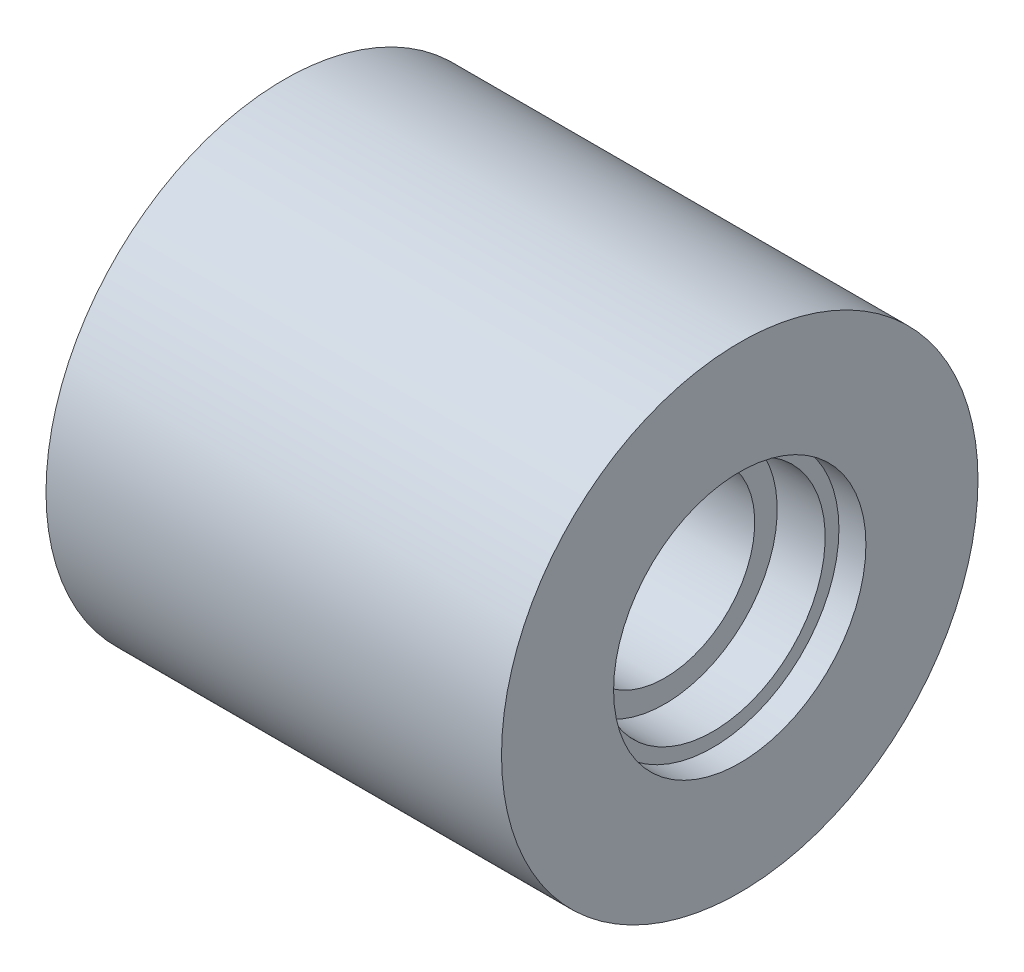
ISO-10303-21;
HEADER;
FILE_DESCRIPTION(('STEP AP214'),'2;1');
FILE_NAME('part.step','',(''),(''),'','','');
FILE_SCHEMA(('AUTOMOTIVE_DESIGN { 1 0 10303 214 1 1 1 1 }'));
ENDSEC;
DATA;
#1=APPLICATION_CONTEXT('core data for automotive mechanical design processes');
#2=APPLICATION_PROTOCOL_DEFINITION('international standard','automotive_design',2000,#1);
#3=PRODUCT_CONTEXT('',#1,'mechanical');
#4=PRODUCT('Part','Part','',(#3));
#5=PRODUCT_RELATED_PRODUCT_CATEGORY('part','',(#4));
#6=PRODUCT_DEFINITION_FORMATION('','',#4);
#7=PRODUCT_DEFINITION_CONTEXT('part definition',#1,'design');
#8=PRODUCT_DEFINITION('design','',#6,#7);
#9=PRODUCT_DEFINITION_SHAPE('','',#8);
#10=(LENGTH_UNIT() NAMED_UNIT(*) SI_UNIT(.MILLI.,.METRE.));
#11=(NAMED_UNIT(*) PLANE_ANGLE_UNIT() SI_UNIT($,.RADIAN.));
#12=(NAMED_UNIT(*) SI_UNIT($,.STERADIAN.) SOLID_ANGLE_UNIT());
#13=UNCERTAINTY_MEASURE_WITH_UNIT(LENGTH_MEASURE(1.E-05),#10,'distance_accuracy_value','');
#14=(GEOMETRIC_REPRESENTATION_CONTEXT(3) GLOBAL_UNCERTAINTY_ASSIGNED_CONTEXT((#13)) GLOBAL_UNIT_ASSIGNED_CONTEXT((#10,
#11,#12)) REPRESENTATION_CONTEXT('',''));
#15=CARTESIAN_POINT('',(0.,0.,0.));
#16=DIRECTION('',(0.,0.,1.));
#17=DIRECTION('',(1.,0.,0.));
#18=AXIS2_PLACEMENT_3D('',#15,#16,#17);
#19=CARTESIAN_POINT('',(-21.3359999999964,0.,0.));
#20=DIRECTION('',(-1.,0.,0.));
#21=DIRECTION('',(0.,0.,1.));
#22=AXIS2_PLACEMENT_3D('',#19,#20,#21);
#23=CYLINDRICAL_SURFACE('',#22,10.0965);
#24=CARTESIAN_POINT('',(-9.652,0.,0.));
#25=DIRECTION('',(-1.,0.,0.));
#26=DIRECTION('',(0.,0.,1.));
#27=AXIS2_PLACEMENT_3D('',#24,#25,#26);
#28=CIRCLE('',#27,10.0965);
#29=CARTESIAN_POINT('',(-9.652,0.,10.0965));
#30=VERTEX_POINT('',#29);
#31=EDGE_CURVE('E10',#30,#30,#28,.T.);
#32=ORIENTED_EDGE('',*,*,#31,.F.);
#33=EDGE_LOOP('',(#32));
#34=FACE_BOUND('',#33,.T.);
#35=CARTESIAN_POINT('',(9.652,0.,0.));
#36=DIRECTION('',(-1.,0.,0.));
#37=DIRECTION('',(0.,0.,1.));
#38=AXIS2_PLACEMENT_3D('',#35,#36,#37);
#39=CIRCLE('',#38,10.0965);
#40=CARTESIAN_POINT('',(9.652,0.,10.0965));
#41=VERTEX_POINT('',#40);
#42=EDGE_CURVE('E73',#41,#41,#39,.T.);
#43=ORIENTED_EDGE('',*,*,#42,.T.);
#44=EDGE_LOOP('',(#43));
#45=FACE_BOUND('',#44,.T.);
#46=ADVANCED_FACE('F33',(#34,#45),#23,.T.);
#47=CARTESIAN_POINT('',(-9.652,0.,0.));
#48=DIRECTION('',(-1.,0.,0.));
#49=DIRECTION('',(0.,0.,1.));
#50=AXIS2_PLACEMENT_3D('',#47,#48,#49);
#51=PLANE('',#50);
#52=ORIENTED_EDGE('',*,*,#31,.T.);
#53=EDGE_LOOP('',(#52));
#54=FACE_BOUND('',#53,.T.);
#55=CARTESIAN_POINT('',(-9.652,0.,0.));
#56=DIRECTION('',(-1.,0.,0.));
#57=DIRECTION('',(0.,0.,1.));
#58=AXIS2_PLACEMENT_3D('',#55,#56,#57);
#59=CIRCLE('',#58,5.3467);
#60=CARTESIAN_POINT('',(-9.652,0.,5.3467));
#61=VERTEX_POINT('',#60);
#62=EDGE_CURVE('E39',#61,#61,#59,.T.);
#63=ORIENTED_EDGE('',*,*,#62,.F.);
#64=EDGE_LOOP('',(#63));
#65=FACE_BOUND('',#64,.T.);
#66=ADVANCED_FACE('F126',(#54,#65),#51,.T.);
#67=CARTESIAN_POINT('',(-21.3359999999964,0.,0.));
#68=DIRECTION('',(-1.,0.,0.));
#69=DIRECTION('',(0.,0.,1.));
#70=AXIS2_PLACEMENT_3D('',#67,#68,#69);
#71=CYLINDRICAL_SURFACE('',#70,5.3467);
#72=ORIENTED_EDGE('',*,*,#62,.T.);
#73=EDGE_LOOP('',(#72));
#74=FACE_BOUND('',#73,.T.);
#75=CARTESIAN_POINT('',(-8.509,0.,0.));
#76=DIRECTION('',(-1.,0.,0.));
#77=DIRECTION('',(0.,0.,1.));
#78=AXIS2_PLACEMENT_3D('',#75,#76,#77);
#79=CIRCLE('',#78,5.3467);
#80=CARTESIAN_POINT('',(-8.509,0.,5.3467));
#81=VERTEX_POINT('',#80);
#82=EDGE_CURVE('E43',#81,#81,#79,.T.);
#83=ORIENTED_EDGE('',*,*,#82,.F.);
#84=EDGE_LOOP('',(#83));
#85=FACE_BOUND('',#84,.T.);
#86=ADVANCED_FACE('F131',(#74,#85),#71,.F.);
#87=CARTESIAN_POINT('',(-8.509,0.,0.));
#88=DIRECTION('',(-1.,0.,0.));
#89=DIRECTION('',(0.,0.,1.));
#90=AXIS2_PLACEMENT_3D('',#87,#88,#89);
#91=PLANE('',#90);
#92=ORIENTED_EDGE('',*,*,#82,.T.);
#93=EDGE_LOOP('',(#92));
#94=FACE_BOUND('',#93,.T.);
#95=CARTESIAN_POINT('',(-8.509,0.,0.));
#96=DIRECTION('',(-1.,0.,0.));
#97=DIRECTION('',(0.,0.,1.));
#98=AXIS2_PLACEMENT_3D('',#95,#96,#97);
#99=CIRCLE('',#98,4.7625);
#100=CARTESIAN_POINT('',(-8.509,0.,4.7625));
#101=VERTEX_POINT('',#100);
#102=EDGE_CURVE('E47',#101,#101,#99,.T.);
#103=ORIENTED_EDGE('',*,*,#102,.F.);
#104=EDGE_LOOP('',(#103));
#105=FACE_BOUND('',#104,.T.);
#106=ADVANCED_FACE('F122',(#94,#105),#91,.T.);
#107=CARTESIAN_POINT('',(-21.3359999999964,0.,0.));
#108=DIRECTION('',(-1.,0.,0.));
#109=DIRECTION('',(0.,0.,1.));
#110=AXIS2_PLACEMENT_3D('',#107,#108,#109);
#111=CYLINDRICAL_SURFACE('',#110,4.7625);
#112=ORIENTED_EDGE('',*,*,#102,.T.);
#113=EDGE_LOOP('',(#112));
#114=FACE_BOUND('',#113,.T.);
#115=CARTESIAN_POINT('',(-6.477,0.,0.));
#116=DIRECTION('',(-1.,0.,0.));
#117=DIRECTION('',(0.,0.,1.));
#118=AXIS2_PLACEMENT_3D('',#115,#116,#117);
#119=CIRCLE('',#118,4.7625);
#120=CARTESIAN_POINT('',(-6.477,0.,4.7625));
#121=VERTEX_POINT('',#120);
#122=EDGE_CURVE('E52',#121,#121,#119,.T.);
#123=ORIENTED_EDGE('',*,*,#122,.F.);
#124=EDGE_LOOP('',(#123));
#125=FACE_BOUND('',#124,.T.);
#126=ADVANCED_FACE('F116',(#114,#125),#111,.F.);
#127=CARTESIAN_POINT('',(-6.477,0.,0.));
#128=DIRECTION('',(-1.,0.,0.));
#129=DIRECTION('',(0.,0.,1.));
#130=AXIS2_PLACEMENT_3D('',#127,#128,#129);
#131=PLANE('',#130);
#132=ORIENTED_EDGE('',*,*,#122,.T.);
#133=EDGE_LOOP('',(#132));
#134=FACE_BOUND('',#133,.T.);
#135=CARTESIAN_POINT('',(-6.477,0.,0.));
#136=DIRECTION('',(-1.,0.,0.));
#137=DIRECTION('',(0.,0.,1.));
#138=AXIS2_PLACEMENT_3D('',#135,#136,#137);
#139=CIRCLE('',#138,3.81);
#140=CARTESIAN_POINT('',(-6.477,0.,3.81));
#141=VERTEX_POINT('',#140);
#142=EDGE_CURVE('E55',#141,#141,#139,.T.);
#143=ORIENTED_EDGE('',*,*,#142,.F.);
#144=EDGE_LOOP('',(#143));
#145=FACE_BOUND('',#144,.T.);
#146=ADVANCED_FACE('F111',(#134,#145),#131,.T.);
#147=CARTESIAN_POINT('',(-21.3359999999964,0.,0.));
#148=DIRECTION('',(-1.,0.,0.));
#149=DIRECTION('',(0.,0.,1.));
#150=AXIS2_PLACEMENT_3D('',#147,#148,#149);
#151=CYLINDRICAL_SURFACE('',#150,3.81);
#152=CARTESIAN_POINT('',(6.477,0.,0.));
#153=DIRECTION('',(-1.,0.,0.));
#154=DIRECTION('',(0.,0.,1.));
#155=AXIS2_PLACEMENT_3D('',#152,#153,#154);
#156=CIRCLE('',#155,3.81);
#157=CARTESIAN_POINT('',(6.477,0.,3.81));
#158=VERTEX_POINT('',#157);
#159=EDGE_CURVE('E58',#158,#158,#156,.T.);
#160=ORIENTED_EDGE('',*,*,#159,.F.);
#161=EDGE_LOOP('',(#160));
#162=FACE_BOUND('',#161,.T.);
#163=ORIENTED_EDGE('',*,*,#142,.T.);
#164=EDGE_LOOP('',(#163));
#165=FACE_BOUND('',#164,.T.);
#166=ADVANCED_FACE('F105',(#162,#165),#151,.F.);
#167=CARTESIAN_POINT('',(6.477,0.,0.));
#168=DIRECTION('',(-1.,0.,0.));
#169=DIRECTION('',(0.,0.,1.));
#170=AXIS2_PLACEMENT_3D('',#167,#168,#169);
#171=PLANE('',#170);
#172=CARTESIAN_POINT('',(6.477,0.,0.));
#173=DIRECTION('',(-1.,0.,0.));
#174=DIRECTION('',(0.,0.,1.));
#175=AXIS2_PLACEMENT_3D('',#172,#173,#174);
#176=CIRCLE('',#175,4.7625);
#177=CARTESIAN_POINT('',(6.477,0.,4.7625));
#178=VERTEX_POINT('',#177);
#179=EDGE_CURVE('E61',#178,#178,#176,.T.);
#180=ORIENTED_EDGE('',*,*,#179,.F.);
#181=EDGE_LOOP('',(#180));
#182=FACE_BOUND('',#181,.T.);
#183=ORIENTED_EDGE('',*,*,#159,.T.);
#184=EDGE_LOOP('',(#183));
#185=FACE_BOUND('',#184,.T.);
#186=ADVANCED_FACE('F99',(#182,#185),#171,.F.);
#187=CARTESIAN_POINT('',(-21.3359999999964,0.,0.));
#188=DIRECTION('',(-1.,0.,0.));
#189=DIRECTION('',(0.,0.,1.));
#190=AXIS2_PLACEMENT_3D('',#187,#188,#189);
#191=CYLINDRICAL_SURFACE('',#190,4.7625);
#192=CARTESIAN_POINT('',(8.509,0.,0.));
#193=DIRECTION('',(-1.,0.,0.));
#194=DIRECTION('',(0.,0.,1.));
#195=AXIS2_PLACEMENT_3D('',#192,#193,#194);
#196=CIRCLE('',#195,4.7625);
#197=CARTESIAN_POINT('',(8.509,0.,4.7625));
#198=VERTEX_POINT('',#197);
#199=EDGE_CURVE('E64',#198,#198,#196,.T.);
#200=ORIENTED_EDGE('',*,*,#199,.F.);
#201=EDGE_LOOP('',(#200));
#202=FACE_BOUND('',#201,.T.);
#203=ORIENTED_EDGE('',*,*,#179,.T.);
#204=EDGE_LOOP('',(#203));
#205=FACE_BOUND('',#204,.T.);
#206=ADVANCED_FACE('F93',(#202,#205),#191,.F.);
#207=CARTESIAN_POINT('',(8.509,0.,0.));
#208=DIRECTION('',(-1.,0.,0.));
#209=DIRECTION('',(0.,0.,1.));
#210=AXIS2_PLACEMENT_3D('',#207,#208,#209);
#211=PLANE('',#210);
#212=CARTESIAN_POINT('',(8.509,0.,0.));
#213=DIRECTION('',(-1.,0.,0.));
#214=DIRECTION('',(0.,0.,1.));
#215=AXIS2_PLACEMENT_3D('',#212,#213,#214);
#216=CIRCLE('',#215,5.3467);
#217=CARTESIAN_POINT('',(8.509,0.,5.3467));
#218=VERTEX_POINT('',#217);
#219=EDGE_CURVE('E67',#218,#218,#216,.T.);
#220=ORIENTED_EDGE('',*,*,#219,.F.);
#221=EDGE_LOOP('',(#220));
#222=FACE_BOUND('',#221,.T.);
#223=ORIENTED_EDGE('',*,*,#199,.T.);
#224=EDGE_LOOP('',(#223));
#225=FACE_BOUND('',#224,.T.);
#226=ADVANCED_FACE('F87',(#222,#225),#211,.F.);
#227=CARTESIAN_POINT('',(-21.3359999999964,0.,0.));
#228=DIRECTION('',(-1.,0.,0.));
#229=DIRECTION('',(0.,0.,1.));
#230=AXIS2_PLACEMENT_3D('',#227,#228,#229);
#231=CYLINDRICAL_SURFACE('',#230,5.3467);
#232=CARTESIAN_POINT('',(9.652,0.,0.));
#233=DIRECTION('',(-1.,0.,0.));
#234=DIRECTION('',(0.,0.,1.));
#235=AXIS2_PLACEMENT_3D('',#232,#233,#234);
#236=CIRCLE('',#235,5.3467);
#237=CARTESIAN_POINT('',(9.652,0.,5.3467));
#238=VERTEX_POINT('',#237);
#239=EDGE_CURVE('E70',#238,#238,#236,.T.);
#240=ORIENTED_EDGE('',*,*,#239,.F.);
#241=EDGE_LOOP('',(#240));
#242=FACE_BOUND('',#241,.T.);
#243=ORIENTED_EDGE('',*,*,#219,.T.);
#244=EDGE_LOOP('',(#243));
#245=FACE_BOUND('',#244,.T.);
#246=ADVANCED_FACE('F81',(#242,#245),#231,.F.);
#247=CARTESIAN_POINT('',(9.652,0.,0.));
#248=DIRECTION('',(-1.,0.,0.));
#249=DIRECTION('',(0.,0.,1.));
#250=AXIS2_PLACEMENT_3D('',#247,#248,#249);
#251=PLANE('',#250);
#252=ORIENTED_EDGE('',*,*,#42,.F.);
#253=EDGE_LOOP('',(#252));
#254=FACE_BOUND('',#253,.T.);
#255=ORIENTED_EDGE('',*,*,#239,.T.);
#256=EDGE_LOOP('',(#255));
#257=FACE_BOUND('',#256,.T.);
#258=ADVANCED_FACE('F78',(#254,#257),#251,.F.);
#259=CLOSED_SHELL('',(#46,#66,#86,#106,#126,#146,#166,#186,#206,#226,#246,#258));
#260=MANIFOLD_SOLID_BREP('B2',#259);
#261=ADVANCED_BREP_SHAPE_REPRESENTATION('',(#18,#260),#14);
#262=SHAPE_DEFINITION_REPRESENTATION(#9,#261);
ENDSEC;
END-ISO-10303-21;
